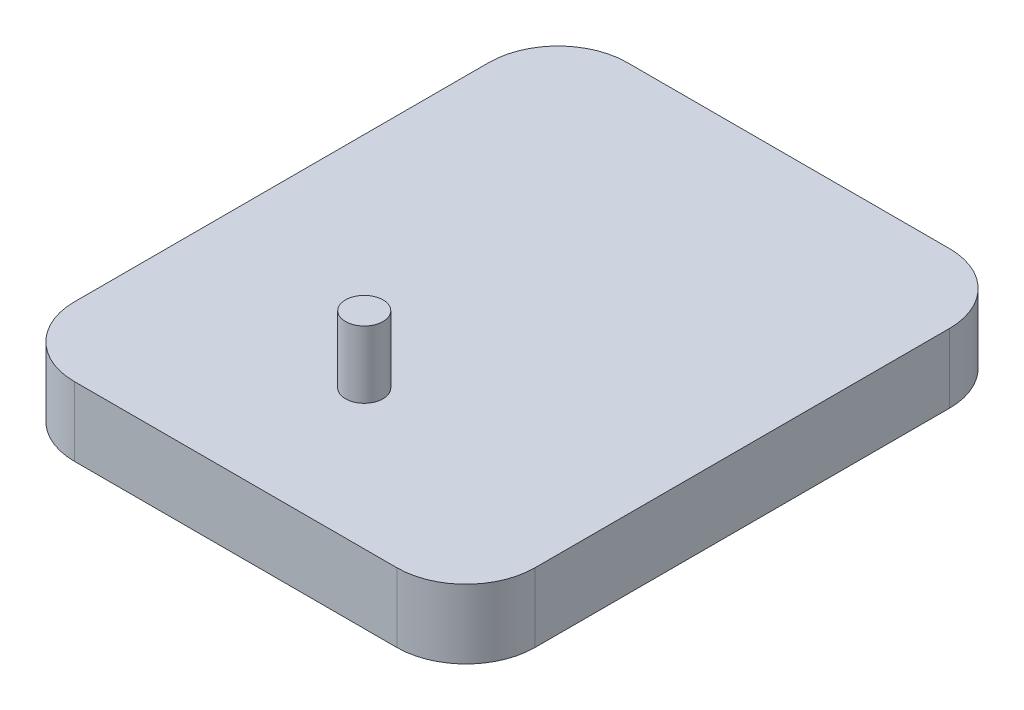
ISO-10303-21;
HEADER;
FILE_DESCRIPTION(('STEP AP214'),'2;1');
FILE_NAME('part.step','',(''),(''),'','','');
FILE_SCHEMA(('AUTOMOTIVE_DESIGN { 1 0 10303 214 1 1 1 1 }'));
ENDSEC;
DATA;
#1=APPLICATION_CONTEXT('core data for automotive mechanical design processes');
#2=APPLICATION_PROTOCOL_DEFINITION('international standard','automotive_design',2000,#1);
#3=PRODUCT_CONTEXT('',#1,'mechanical');
#4=PRODUCT('Part','Part','',(#3));
#5=PRODUCT_RELATED_PRODUCT_CATEGORY('part','',(#4));
#6=PRODUCT_DEFINITION_FORMATION('','',#4);
#7=PRODUCT_DEFINITION_CONTEXT('part definition',#1,'design');
#8=PRODUCT_DEFINITION('design','',#6,#7);
#9=PRODUCT_DEFINITION_SHAPE('','',#8);
#10=(LENGTH_UNIT() NAMED_UNIT(*) SI_UNIT(.MILLI.,.METRE.));
#11=(NAMED_UNIT(*) PLANE_ANGLE_UNIT() SI_UNIT($,.RADIAN.));
#12=(NAMED_UNIT(*) SI_UNIT($,.STERADIAN.) SOLID_ANGLE_UNIT());
#13=UNCERTAINTY_MEASURE_WITH_UNIT(LENGTH_MEASURE(1.E-05),#10,'distance_accuracy_value','');
#14=(GEOMETRIC_REPRESENTATION_CONTEXT(3) GLOBAL_UNCERTAINTY_ASSIGNED_CONTEXT((#13)) GLOBAL_UNIT_ASSIGNED_CONTEXT((#10,
#11,#12)) REPRESENTATION_CONTEXT('',''));
#15=CARTESIAN_POINT('',(0.,0.,0.));
#16=DIRECTION('',(0.,0.,1.));
#17=DIRECTION('',(1.,0.,0.));
#18=AXIS2_PLACEMENT_3D('',#15,#16,#17);
#19=CARTESIAN_POINT('',(0.,80.9453000938894,81.4767223054108));
#20=DIRECTION('',(0.,1.,0.));
#21=DIRECTION('',(0.,0.,1.));
#22=AXIS2_PLACEMENT_3D('',#19,#20,#21);
#23=CYLINDRICAL_SURFACE('',#22,10.3533956520688);
#24=CARTESIAN_POINT('',(0.,44.033193856079,81.4767223054108));
#25=DIRECTION('',(0.,1.,0.));
#26=DIRECTION('',(0.,0.,1.));
#27=AXIS2_PLACEMENT_3D('',#24,#25,#26);
#28=CIRCLE('',#27,10.3533956520688);
#29=CARTESIAN_POINT('',(0.,44.033193856079,91.8301179574795));
#30=VERTEX_POINT('',#29);
#31=EDGE_CURVE('E11',#30,#30,#28,.T.);
#32=ORIENTED_EDGE('',*,*,#31,.T.);
#33=EDGE_LOOP('',(#32));
#34=FACE_BOUND('',#33,.T.);
#35=CARTESIAN_POINT('',(0.,80.9453000938894,81.4767223054108));
#36=DIRECTION('',(0.,1.,0.));
#37=DIRECTION('',(0.,0.,1.));
#38=AXIS2_PLACEMENT_3D('',#35,#36,#37);
#39=CIRCLE('',#38,10.3533956520688);
#40=CARTESIAN_POINT('',(0.,80.9453000938894,91.8301179574795));
#41=VERTEX_POINT('',#40);
#42=EDGE_CURVE('E49',#41,#41,#39,.T.);
#43=ORIENTED_EDGE('',*,*,#42,.F.);
#44=EDGE_LOOP('',(#43));
#45=FACE_BOUND('',#44,.T.);
#46=ADVANCED_FACE('F43',(#34,#45),#23,.T.);
#47=CARTESIAN_POINT('',(0.,44.033193856079,91.8301179574795));
#48=DIRECTION('',(0.,-1.,0.));
#49=DIRECTION('',(0.,0.,-1.));
#50=AXIS2_PLACEMENT_3D('',#47,#48,#49);
#51=PLANE('',#50);
#52=ORIENTED_EDGE('',*,*,#31,.F.);
#53=EDGE_LOOP('',(#52));
#54=FACE_BOUND('',#53,.T.);
#55=ADVANCED_FACE('F58',(#54),#51,.T.);
#56=CARTESIAN_POINT('',(0.,80.9453000938894,91.8301179574795));
#57=DIRECTION('',(0.,1.,0.));
#58=DIRECTION('',(0.,0.,1.));
#59=AXIS2_PLACEMENT_3D('',#56,#57,#58);
#60=PLANE('',#59);
#61=ORIENTED_EDGE('',*,*,#42,.T.);
#62=EDGE_LOOP('',(#61));
#63=FACE_BOUND('',#62,.T.);
#64=ADVANCED_FACE('F55',(#63),#60,.T.);
#65=CLOSED_SHELL('',(#46,#55,#64));
#66=MANIFOLD_SOLID_BREP('B2',#65);
#67=CARTESIAN_POINT('',(-127.,38.1,-152.4));
#68=DIRECTION('',(1.,0.,0.));
#69=DIRECTION('',(0.,0.,-1.));
#70=AXIS2_PLACEMENT_3D('',#67,#68,#69);
#71=PLANE('',#70);
#72=DIRECTION('',(0.,0.,1.));
#73=VECTOR('',#72,1.);
#74=CARTESIAN_POINT('',(-127.,38.1,-152.4));
#75=LINE('',#74,#73);
#76=CARTESIAN_POINT('',(-127.,38.1,-114.3));
#77=VERTEX_POINT('',#76);
#78=CARTESIAN_POINT('',(-127.,38.1,114.3));
#79=VERTEX_POINT('',#78);
#80=EDGE_CURVE('E168',#77,#79,#75,.T.);
#81=ORIENTED_EDGE('',*,*,#80,.F.);
#82=DIRECTION('',(0.,-1.,0.));
#83=VECTOR('',#82,1.);
#84=CARTESIAN_POINT('',(-127.,38.1,-114.3));
#85=LINE('',#84,#83);
#86=CARTESIAN_POINT('',(-127.,0.,-114.3));
#87=VERTEX_POINT('',#86);
#88=EDGE_CURVE('E153',#77,#87,#85,.T.);
#89=ORIENTED_EDGE('',*,*,#88,.T.);
#90=DIRECTION('',(0.,0.,1.));
#91=VECTOR('',#90,1.);
#92=CARTESIAN_POINT('',(-127.,0.,-152.4));
#93=LINE('',#92,#91);
#94=CARTESIAN_POINT('',(-127.,0.,114.3));
#95=VERTEX_POINT('',#94);
#96=EDGE_CURVE('E165',#87,#95,#93,.T.);
#97=ORIENTED_EDGE('',*,*,#96,.T.);
#98=DIRECTION('',(0.,-1.,0.));
#99=VECTOR('',#98,1.);
#100=CARTESIAN_POINT('',(-127.,38.1,114.3));
#101=LINE('',#100,#99);
#102=EDGE_CURVE('E170',#95,#79,#101,.F.);
#103=ORIENTED_EDGE('',*,*,#102,.T.);
#104=EDGE_LOOP('',(#81,#89,#97,#103));
#105=FACE_BOUND('',#104,.T.);
#106=ADVANCED_FACE('F83',(#105),#71,.F.);
#107=CARTESIAN_POINT('',(-127.,38.1,152.4));
#108=DIRECTION('',(0.,0.,-1.));
#109=DIRECTION('',(-1.,0.,0.));
#110=AXIS2_PLACEMENT_3D('',#107,#108,#109);
#111=PLANE('',#110);
#112=DIRECTION('',(1.,0.,0.));
#113=VECTOR('',#112,1.);
#114=CARTESIAN_POINT('',(-127.,0.,152.4));
#115=LINE('',#114,#113);
#116=CARTESIAN_POINT('',(-88.9,0.,152.4));
#117=VERTEX_POINT('',#116);
#118=CARTESIAN_POINT('',(88.9,0.,152.4));
#119=VERTEX_POINT('',#118);
#120=EDGE_CURVE('E174',#117,#119,#115,.T.);
#121=ORIENTED_EDGE('',*,*,#120,.T.);
#122=DIRECTION('',(0.,-1.,0.));
#123=VECTOR('',#122,1.);
#124=CARTESIAN_POINT('',(88.9,38.1,152.4));
#125=LINE('',#124,#123);
#126=CARTESIAN_POINT('',(88.9,38.1,152.4));
#127=VERTEX_POINT('',#126);
#128=EDGE_CURVE('E41',#119,#127,#125,.F.);
#129=ORIENTED_EDGE('',*,*,#128,.T.);
#130=DIRECTION('',(1.,0.,0.));
#131=VECTOR('',#130,1.);
#132=CARTESIAN_POINT('',(-127.,38.1,152.4));
#133=LINE('',#132,#131);
#134=CARTESIAN_POINT('',(-88.9,38.1,152.4));
#135=VERTEX_POINT('',#134);
#136=EDGE_CURVE('E210',#135,#127,#133,.T.);
#137=ORIENTED_EDGE('',*,*,#136,.F.);
#138=DIRECTION('',(0.,-1.,0.));
#139=VECTOR('',#138,1.);
#140=CARTESIAN_POINT('',(-88.9,38.1,152.4));
#141=LINE('',#140,#139);
#142=EDGE_CURVE('E91',#135,#117,#141,.T.);
#143=ORIENTED_EDGE('',*,*,#142,.T.);
#144=EDGE_LOOP('',(#121,#129,#137,#143));
#145=FACE_BOUND('',#144,.T.);
#146=ADVANCED_FACE('F208',(#145),#111,.F.);
#147=CARTESIAN_POINT('',(127.,38.1,-152.4));
#148=DIRECTION('',(-1.,0.,0.));
#149=DIRECTION('',(0.,0.,1.));
#150=AXIS2_PLACEMENT_3D('',#147,#148,#149);
#151=PLANE('',#150);
#152=DIRECTION('',(0.,0.,-1.));
#153=VECTOR('',#152,1.);
#154=CARTESIAN_POINT('',(127.,0.,-152.4));
#155=LINE('',#154,#153);
#156=CARTESIAN_POINT('',(127.,0.,114.3));
#157=VERTEX_POINT('',#156);
#158=CARTESIAN_POINT('',(127.,0.,-114.3));
#159=VERTEX_POINT('',#158);
#160=EDGE_CURVE('E177',#157,#159,#155,.T.);
#161=ORIENTED_EDGE('',*,*,#160,.T.);
#162=DIRECTION('',(0.,-1.,0.));
#163=VECTOR('',#162,1.);
#164=CARTESIAN_POINT('',(127.,38.1,-114.3));
#165=LINE('',#164,#163);
#166=CARTESIAN_POINT('',(127.,38.1,-114.3));
#167=VERTEX_POINT('',#166);
#168=EDGE_CURVE('E98',#159,#167,#165,.F.);
#169=ORIENTED_EDGE('',*,*,#168,.T.);
#170=DIRECTION('',(0.,0.,-1.));
#171=VECTOR('',#170,1.);
#172=CARTESIAN_POINT('',(127.,38.1,-152.4));
#173=LINE('',#172,#171);
#174=CARTESIAN_POINT('',(127.,38.1,114.3));
#175=VERTEX_POINT('',#174);
#176=EDGE_CURVE('E218',#175,#167,#173,.T.);
#177=ORIENTED_EDGE('',*,*,#176,.F.);
#178=DIRECTION('',(0.,-1.,0.));
#179=VECTOR('',#178,1.);
#180=CARTESIAN_POINT('',(127.,38.1,114.3));
#181=LINE('',#180,#179);
#182=EDGE_CURVE('E201',#175,#157,#181,.T.);
#183=ORIENTED_EDGE('',*,*,#182,.T.);
#184=EDGE_LOOP('',(#161,#169,#177,#183));
#185=FACE_BOUND('',#184,.T.);
#186=ADVANCED_FACE('F217',(#185),#151,.F.);
#187=CARTESIAN_POINT('',(-127.,38.1,-152.4));
#188=DIRECTION('',(0.,0.,1.));
#189=DIRECTION('',(1.,0.,0.));
#190=AXIS2_PLACEMENT_3D('',#187,#188,#189);
#191=PLANE('',#190);
#192=DIRECTION('',(-1.,0.,0.));
#193=VECTOR('',#192,1.);
#194=CARTESIAN_POINT('',(-127.,0.,-152.4));
#195=LINE('',#194,#193);
#196=CARTESIAN_POINT('',(88.9,0.,-152.4));
#197=VERTEX_POINT('',#196);
#198=CARTESIAN_POINT('',(-88.9,0.,-152.4));
#199=VERTEX_POINT('',#198);
#200=EDGE_CURVE('E184',#197,#199,#195,.T.);
#201=ORIENTED_EDGE('',*,*,#200,.T.);
#202=DIRECTION('',(0.,-1.,0.));
#203=VECTOR('',#202,1.);
#204=CARTESIAN_POINT('',(-88.9,38.1,-152.4));
#205=LINE('',#204,#203);
#206=CARTESIAN_POINT('',(-88.9,38.1,-152.4));
#207=VERTEX_POINT('',#206);
#208=EDGE_CURVE('E154',#199,#207,#205,.F.);
#209=ORIENTED_EDGE('',*,*,#208,.T.);
#210=DIRECTION('',(-1.,0.,0.));
#211=VECTOR('',#210,1.);
#212=CARTESIAN_POINT('',(-127.,38.1,-152.4));
#213=LINE('',#212,#211);
#214=CARTESIAN_POINT('',(88.9,38.1,-152.4));
#215=VERTEX_POINT('',#214);
#216=EDGE_CURVE('E180',#215,#207,#213,.T.);
#217=ORIENTED_EDGE('',*,*,#216,.F.);
#218=DIRECTION('',(0.,-1.,0.));
#219=VECTOR('',#218,1.);
#220=CARTESIAN_POINT('',(88.9,38.1,-152.4));
#221=LINE('',#220,#219);
#222=EDGE_CURVE('E159',#215,#197,#221,.T.);
#223=ORIENTED_EDGE('',*,*,#222,.T.);
#224=EDGE_LOOP('',(#201,#209,#217,#223));
#225=FACE_BOUND('',#224,.T.);
#226=ADVANCED_FACE('F246',(#225),#191,.F.);
#227=CARTESIAN_POINT('',(0.,38.1,0.));
#228=DIRECTION('',(0.,1.,0.));
#229=DIRECTION('',(0.,0.,1.));
#230=AXIS2_PLACEMENT_3D('',#227,#228,#229);
#231=PLANE('',#230);
#232=ORIENTED_EDGE('',*,*,#216,.T.);
#233=CARTESIAN_POINT('',(-88.9,38.1,-114.3));
#234=DIRECTION('',(0.,1.,0.));
#235=DIRECTION('',(0.,0.,1.));
#236=AXIS2_PLACEMENT_3D('',#233,#234,#235);
#237=CIRCLE('',#236,38.1);
#238=EDGE_CURVE('E199',#207,#77,#237,.T.);
#239=ORIENTED_EDGE('',*,*,#238,.T.);
#240=ORIENTED_EDGE('',*,*,#80,.T.);
#241=CARTESIAN_POINT('',(-88.9,38.1,114.3));
#242=DIRECTION('',(0.,1.,0.));
#243=DIRECTION('',(0.,0.,1.));
#244=AXIS2_PLACEMENT_3D('',#241,#242,#243);
#245=CIRCLE('',#244,38.1);
#246=EDGE_CURVE('E194',#79,#135,#245,.T.);
#247=ORIENTED_EDGE('',*,*,#246,.T.);
#248=ORIENTED_EDGE('',*,*,#136,.T.);
#249=CARTESIAN_POINT('',(88.9,38.1,114.3));
#250=DIRECTION('',(0.,1.,0.));
#251=DIRECTION('',(0.,0.,1.));
#252=AXIS2_PLACEMENT_3D('',#249,#250,#251);
#253=CIRCLE('',#252,38.1);
#254=EDGE_CURVE('E105',#127,#175,#253,.T.);
#255=ORIENTED_EDGE('',*,*,#254,.T.);
#256=ORIENTED_EDGE('',*,*,#176,.T.);
#257=CARTESIAN_POINT('',(88.9,38.1,-114.3));
#258=DIRECTION('',(0.,1.,0.));
#259=DIRECTION('',(0.,0.,1.));
#260=AXIS2_PLACEMENT_3D('',#257,#258,#259);
#261=CIRCLE('',#260,38.1);
#262=EDGE_CURVE('E197',#167,#215,#261,.T.);
#263=ORIENTED_EDGE('',*,*,#262,.T.);
#264=EDGE_LOOP('',(#232,#239,#240,#247,#248,#255,#256,#263));
#265=FACE_BOUND('',#264,.T.);
#266=ADVANCED_FACE('F223',(#265),#231,.T.);
#267=CARTESIAN_POINT('',(0.,0.,0.));
#268=DIRECTION('',(0.,1.,0.));
#269=DIRECTION('',(0.,0.,1.));
#270=AXIS2_PLACEMENT_3D('',#267,#268,#269);
#271=PLANE('',#270);
#272=ORIENTED_EDGE('',*,*,#96,.F.);
#273=CARTESIAN_POINT('',(-88.9,0.,-114.3));
#274=DIRECTION('',(0.,1.,0.));
#275=DIRECTION('',(0.,0.,1.));
#276=AXIS2_PLACEMENT_3D('',#273,#274,#275);
#277=CIRCLE('',#276,38.1);
#278=EDGE_CURVE('E149',#87,#199,#277,.F.);
#279=ORIENTED_EDGE('',*,*,#278,.T.);
#280=ORIENTED_EDGE('',*,*,#200,.F.);
#281=CARTESIAN_POINT('',(88.9,0.,-114.3));
#282=DIRECTION('',(0.,1.,0.));
#283=DIRECTION('',(0.,0.,1.));
#284=AXIS2_PLACEMENT_3D('',#281,#282,#283);
#285=CIRCLE('',#284,38.1);
#286=EDGE_CURVE('E160',#197,#159,#285,.F.);
#287=ORIENTED_EDGE('',*,*,#286,.T.);
#288=ORIENTED_EDGE('',*,*,#160,.F.);
#289=CARTESIAN_POINT('',(88.9,0.,114.3));
#290=DIRECTION('',(0.,1.,0.));
#291=DIRECTION('',(0.,0.,1.));
#292=AXIS2_PLACEMENT_3D('',#289,#290,#291);
#293=CIRCLE('',#292,38.1);
#294=EDGE_CURVE('E188',#157,#119,#293,.F.);
#295=ORIENTED_EDGE('',*,*,#294,.T.);
#296=ORIENTED_EDGE('',*,*,#120,.F.);
#297=CARTESIAN_POINT('',(-88.9,0.,114.3));
#298=DIRECTION('',(0.,1.,0.));
#299=DIRECTION('',(0.,0.,1.));
#300=AXIS2_PLACEMENT_3D('',#297,#298,#299);
#301=CIRCLE('',#300,38.1);
#302=EDGE_CURVE('E169',#117,#95,#301,.F.);
#303=ORIENTED_EDGE('',*,*,#302,.T.);
#304=EDGE_LOOP('',(#272,#279,#280,#287,#288,#295,#296,#303));
#305=FACE_BOUND('',#304,.T.);
#306=ADVANCED_FACE('F172',(#305),#271,.F.);
#307=CARTESIAN_POINT('',(-88.9,38.1,-114.3));
#308=DIRECTION('',(0.,-1.,0.));
#309=DIRECTION('',(0.,0.,-1.));
#310=AXIS2_PLACEMENT_3D('',#307,#308,#309);
#311=CYLINDRICAL_SURFACE('',#310,38.1);
#312=ORIENTED_EDGE('',*,*,#238,.F.);
#313=ORIENTED_EDGE('',*,*,#208,.F.);
#314=ORIENTED_EDGE('',*,*,#278,.F.);
#315=ORIENTED_EDGE('',*,*,#88,.F.);
#316=EDGE_LOOP('',(#312,#313,#314,#315));
#317=FACE_BOUND('',#316,.T.);
#318=ADVANCED_FACE('F152',(#317),#311,.T.);
#319=CARTESIAN_POINT('',(88.9,38.1,-114.3));
#320=DIRECTION('',(0.,-1.,0.));
#321=DIRECTION('',(0.,0.,-1.));
#322=AXIS2_PLACEMENT_3D('',#319,#320,#321);
#323=CYLINDRICAL_SURFACE('',#322,38.1);
#324=ORIENTED_EDGE('',*,*,#262,.F.);
#325=ORIENTED_EDGE('',*,*,#168,.F.);
#326=ORIENTED_EDGE('',*,*,#286,.F.);
#327=ORIENTED_EDGE('',*,*,#222,.F.);
#328=EDGE_LOOP('',(#324,#325,#326,#327));
#329=FACE_BOUND('',#328,.T.);
#330=ADVANCED_FACE('F228',(#329),#323,.T.);
#331=CARTESIAN_POINT('',(88.9,38.1,114.3));
#332=DIRECTION('',(0.,-1.,0.));
#333=DIRECTION('',(0.,0.,-1.));
#334=AXIS2_PLACEMENT_3D('',#331,#332,#333);
#335=CYLINDRICAL_SURFACE('',#334,38.1);
#336=ORIENTED_EDGE('',*,*,#254,.F.);
#337=ORIENTED_EDGE('',*,*,#128,.F.);
#338=ORIENTED_EDGE('',*,*,#294,.F.);
#339=ORIENTED_EDGE('',*,*,#182,.F.);
#340=EDGE_LOOP('',(#336,#337,#338,#339));
#341=FACE_BOUND('',#340,.T.);
#342=ADVANCED_FACE('F216',(#341),#335,.T.);
#343=CARTESIAN_POINT('',(-88.9,38.1,114.3));
#344=DIRECTION('',(0.,-1.,0.));
#345=DIRECTION('',(0.,0.,-1.));
#346=AXIS2_PLACEMENT_3D('',#343,#344,#345);
#347=CYLINDRICAL_SURFACE('',#346,38.1);
#348=ORIENTED_EDGE('',*,*,#246,.F.);
#349=ORIENTED_EDGE('',*,*,#102,.F.);
#350=ORIENTED_EDGE('',*,*,#302,.F.);
#351=ORIENTED_EDGE('',*,*,#142,.F.);
#352=EDGE_LOOP('',(#348,#349,#350,#351));
#353=FACE_BOUND('',#352,.T.);
#354=ADVANCED_FACE('F85',(#353),#347,.T.);
#355=CLOSED_SHELL('',(#106,#146,#186,#226,#266,#306,#318,#330,#342,#354));
#356=MANIFOLD_SOLID_BREP('B6',#355);
#357=ADVANCED_BREP_SHAPE_REPRESENTATION('',(#18,#66,#356),#14);
#358=SHAPE_DEFINITION_REPRESENTATION(#9,#357);
ENDSEC;
END-ISO-10303-21;
